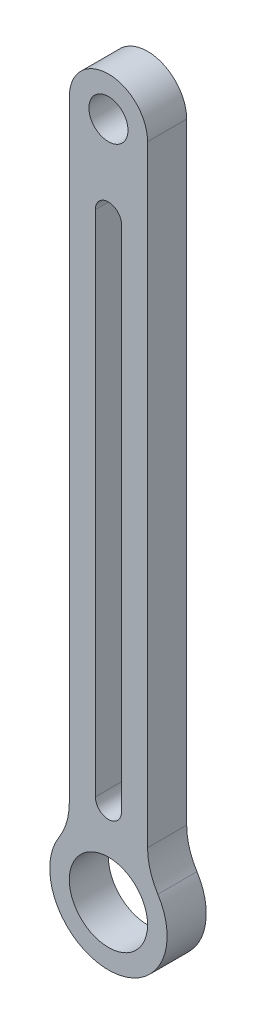
ISO-10303-21;
HEADER;
FILE_DESCRIPTION(('STEP AP214'),'2;1');
FILE_NAME('part.step','',(''),(''),'','','');
FILE_SCHEMA(('AUTOMOTIVE_DESIGN { 1 0 10303 214 1 1 1 1 }'));
ENDSEC;
DATA;
#1=APPLICATION_CONTEXT('core data for automotive mechanical design processes');
#2=APPLICATION_PROTOCOL_DEFINITION('international standard','automotive_design',2000,#1);
#3=PRODUCT_CONTEXT('',#1,'mechanical');
#4=PRODUCT('Part','Part','',(#3));
#5=PRODUCT_RELATED_PRODUCT_CATEGORY('part','',(#4));
#6=PRODUCT_DEFINITION_FORMATION('','',#4);
#7=PRODUCT_DEFINITION_CONTEXT('part definition',#1,'design');
#8=PRODUCT_DEFINITION('design','',#6,#7);
#9=PRODUCT_DEFINITION_SHAPE('','',#8);
#10=(LENGTH_UNIT() NAMED_UNIT(*) SI_UNIT(.MILLI.,.METRE.));
#11=(NAMED_UNIT(*) PLANE_ANGLE_UNIT() SI_UNIT($,.RADIAN.));
#12=(NAMED_UNIT(*) SI_UNIT($,.STERADIAN.) SOLID_ANGLE_UNIT());
#13=UNCERTAINTY_MEASURE_WITH_UNIT(LENGTH_MEASURE(1.E-05),#10,'distance_accuracy_value','');
#14=(GEOMETRIC_REPRESENTATION_CONTEXT(3) GLOBAL_UNCERTAINTY_ASSIGNED_CONTEXT((#13)) GLOBAL_UNIT_ASSIGNED_CONTEXT((#10,
#11,#12)) REPRESENTATION_CONTEXT('',''));
#15=CARTESIAN_POINT('',(0.,0.,0.));
#16=DIRECTION('',(0.,0.,1.));
#17=DIRECTION('',(1.,0.,0.));
#18=AXIS2_PLACEMENT_3D('',#15,#16,#17);
#19=CARTESIAN_POINT('',(6.,-52.,6.));
#20=DIRECTION('',(-1.,0.,0.));
#21=DIRECTION('',(0.,-1.,0.));
#22=AXIS2_PLACEMENT_3D('',#19,#20,#21);
#23=PLANE('',#22);
#24=DIRECTION('',(0.,1.,0.));
#25=VECTOR('',#24,1.);
#26=CARTESIAN_POINT('',(6.,-52.,6.));
#27=LINE('',#26,#25);
#28=CARTESIAN_POINT('',(6.,-41.7530492340404,6.));
#29=VERTEX_POINT('',#28);
#30=CARTESIAN_POINT('',(6.,52.,6.));
#31=VERTEX_POINT('',#30);
#32=EDGE_CURVE('E162',#29,#31,#27,.T.);
#33=ORIENTED_EDGE('',*,*,#32,.F.);
#34=DIRECTION('',(0.,0.,-1.));
#35=VECTOR('',#34,1.);
#36=CARTESIAN_POINT('',(6.,-41.7530492340404,6.));
#37=LINE('',#36,#35);
#38=CARTESIAN_POINT('',(6.,-41.7530492340404,0.));
#39=VERTEX_POINT('',#38);
#40=EDGE_CURVE('E188',#29,#39,#37,.T.);
#41=ORIENTED_EDGE('',*,*,#40,.T.);
#42=DIRECTION('',(0.,1.,0.));
#43=VECTOR('',#42,1.);
#44=CARTESIAN_POINT('',(6.,-52.,0.));
#45=LINE('',#44,#43);
#46=CARTESIAN_POINT('',(6.,52.,0.));
#47=VERTEX_POINT('',#46);
#48=EDGE_CURVE('E161',#39,#47,#45,.T.);
#49=ORIENTED_EDGE('',*,*,#48,.T.);
#50=DIRECTION('',(0.,0.,-1.));
#51=VECTOR('',#50,1.);
#52=CARTESIAN_POINT('',(6.,52.,6.));
#53=LINE('',#52,#51);
#54=EDGE_CURVE('E178',#31,#47,#53,.T.);
#55=ORIENTED_EDGE('',*,*,#54,.F.);
#56=EDGE_LOOP('',(#33,#41,#49,#55));
#57=FACE_BOUND('',#56,.T.);
#58=ADVANCED_FACE('F36',(#57),#23,.F.);
#59=CARTESIAN_POINT('',(0.,52.,6.));
#60=DIRECTION('',(0.,0.,-1.));
#61=DIRECTION('',(-1.,0.,0.));
#62=AXIS2_PLACEMENT_3D('',#59,#60,#61);
#63=CYLINDRICAL_SURFACE('',#62,6.);
#64=CARTESIAN_POINT('',(0.,52.,0.));
#65=DIRECTION('',(0.,0.,1.));
#66=DIRECTION('',(1.,0.,0.));
#67=AXIS2_PLACEMENT_3D('',#64,#65,#66);
#68=CIRCLE('',#67,6.);
#69=CARTESIAN_POINT('',(-6.00000000000002,52.,0.));
#70=VERTEX_POINT('',#69);
#71=EDGE_CURVE('E172',#47,#70,#68,.T.);
#72=ORIENTED_EDGE('',*,*,#71,.T.);
#73=DIRECTION('',(0.,0.,-1.));
#74=VECTOR('',#73,1.);
#75=CARTESIAN_POINT('',(-6.00000000000002,52.,6.));
#76=LINE('',#75,#74);
#77=CARTESIAN_POINT('',(-6.00000000000002,52.,6.));
#78=VERTEX_POINT('',#77);
#79=EDGE_CURVE('E170',#78,#70,#76,.T.);
#80=ORIENTED_EDGE('',*,*,#79,.F.);
#81=CARTESIAN_POINT('',(0.,52.,6.));
#82=DIRECTION('',(0.,0.,1.));
#83=DIRECTION('',(1.,0.,0.));
#84=AXIS2_PLACEMENT_3D('',#81,#82,#83);
#85=CIRCLE('',#84,6.);
#86=EDGE_CURVE('E164',#31,#78,#85,.T.);
#87=ORIENTED_EDGE('',*,*,#86,.F.);
#88=ORIENTED_EDGE('',*,*,#54,.T.);
#89=EDGE_LOOP('',(#72,#80,#87,#88));
#90=FACE_BOUND('',#89,.T.);
#91=ADVANCED_FACE('F215',(#90),#63,.T.);
#92=CARTESIAN_POINT('',(-6.,-52.,6.));
#93=DIRECTION('',(1.,0.,0.));
#94=DIRECTION('',(0.,1.,0.));
#95=AXIS2_PLACEMENT_3D('',#92,#93,#94);
#96=PLANE('',#95);
#97=DIRECTION('',(0.,-1.,0.));
#98=VECTOR('',#97,1.);
#99=CARTESIAN_POINT('',(-6.,-52.,0.));
#100=LINE('',#99,#98);
#101=CARTESIAN_POINT('',(-6.,-41.7530492340404,0.));
#102=VERTEX_POINT('',#101);
#103=EDGE_CURVE('E165',#70,#102,#100,.T.);
#104=ORIENTED_EDGE('',*,*,#103,.T.);
#105=DIRECTION('',(0.,0.,-1.));
#106=VECTOR('',#105,1.);
#107=CARTESIAN_POINT('',(-6.,-41.7530492340404,6.));
#108=LINE('',#107,#106);
#109=CARTESIAN_POINT('',(-6.,-41.7530492340404,6.));
#110=VERTEX_POINT('',#109);
#111=EDGE_CURVE('E181',#102,#110,#108,.F.);
#112=ORIENTED_EDGE('',*,*,#111,.T.);
#113=DIRECTION('',(0.,-1.,0.));
#114=VECTOR('',#113,1.);
#115=CARTESIAN_POINT('',(-6.,-52.,6.));
#116=LINE('',#115,#114);
#117=EDGE_CURVE('E167',#78,#110,#116,.T.);
#118=ORIENTED_EDGE('',*,*,#117,.F.);
#119=ORIENTED_EDGE('',*,*,#79,.T.);
#120=EDGE_LOOP('',(#104,#112,#118,#119));
#121=FACE_BOUND('',#120,.T.);
#122=ADVANCED_FACE('F218',(#121),#96,.F.);
#123=CARTESIAN_POINT('',(0.,-52.,6.));
#124=DIRECTION('',(0.,0.,1.));
#125=DIRECTION('',(1.,0.,0.));
#126=AXIS2_PLACEMENT_3D('',#123,#124,#125);
#127=PLANE('',#126);
#128=CARTESIAN_POINT('',(0.,-39.,6.));
#129=DIRECTION('',(0.,0.,1.));
#130=DIRECTION('',(1.,0.,0.));
#131=AXIS2_PLACEMENT_3D('',#128,#129,#130);
#132=CIRCLE('',#131,2.);
#133=CARTESIAN_POINT('',(-2.,-39.,6.));
#134=VERTEX_POINT('',#133);
#135=CARTESIAN_POINT('',(2.,-39.,6.));
#136=VERTEX_POINT('',#135);
#137=EDGE_CURVE('E51',#134,#136,#132,.T.);
#138=ORIENTED_EDGE('',*,*,#137,.F.);
#139=DIRECTION('',(0.,-1.,0.));
#140=VECTOR('',#139,1.);
#141=CARTESIAN_POINT('',(-2.,-39.,6.));
#142=LINE('',#141,#140);
#143=CARTESIAN_POINT('',(-2.00000000000001,39.,6.));
#144=VERTEX_POINT('',#143);
#145=EDGE_CURVE('E131',#144,#134,#142,.T.);
#146=ORIENTED_EDGE('',*,*,#145,.F.);
#147=CARTESIAN_POINT('',(0.,39.,6.));
#148=DIRECTION('',(0.,0.,1.));
#149=DIRECTION('',(1.,0.,0.));
#150=AXIS2_PLACEMENT_3D('',#147,#148,#149);
#151=CIRCLE('',#150,2.);
#152=CARTESIAN_POINT('',(2.,39.,6.));
#153=VERTEX_POINT('',#152);
#154=EDGE_CURVE('E115',#153,#144,#151,.T.);
#155=ORIENTED_EDGE('',*,*,#154,.F.);
#156=DIRECTION('',(0.,1.,0.));
#157=VECTOR('',#156,1.);
#158=CARTESIAN_POINT('',(2.,-39.,6.));
#159=LINE('',#158,#157);
#160=EDGE_CURVE('E124',#136,#153,#159,.T.);
#161=ORIENTED_EDGE('',*,*,#160,.F.);
#162=EDGE_LOOP('',(#138,#146,#155,#161));
#163=FACE_BOUND('',#162,.T.);
#164=CARTESIAN_POINT('',(0.,-52.,6.));
#165=DIRECTION('',(0.,0.,1.));
#166=DIRECTION('',(1.,0.,0.));
#167=AXIS2_PLACEMENT_3D('',#164,#165,#166);
#168=CIRCLE('',#167,6.);
#169=CARTESIAN_POINT('',(6.,-52.,6.));
#170=VERTEX_POINT('',#169);
#171=EDGE_CURVE('E147',#170,#170,#168,.F.);
#172=ORIENTED_EDGE('',*,*,#171,.T.);
#173=EDGE_LOOP('',(#172));
#174=FACE_BOUND('',#173,.T.);
#175=CARTESIAN_POINT('',(0.,52.,6.));
#176=DIRECTION('',(0.,0.,1.));
#177=DIRECTION('',(1.,0.,0.));
#178=AXIS2_PLACEMENT_3D('',#175,#176,#177);
#179=CIRCLE('',#178,3.);
#180=CARTESIAN_POINT('',(3.,52.,6.));
#181=VERTEX_POINT('',#180);
#182=EDGE_CURVE('E148',#181,#181,#179,.F.);
#183=ORIENTED_EDGE('',*,*,#182,.T.);
#184=EDGE_LOOP('',(#183));
#185=FACE_BOUND('',#184,.T.);
#186=CARTESIAN_POINT('',(0.,-52.,6.));
#187=DIRECTION('',(0.,0.,1.));
#188=DIRECTION('',(1.,0.,0.));
#189=AXIS2_PLACEMENT_3D('',#186,#187,#188);
#190=CIRCLE('',#189,9.);
#191=CARTESIAN_POINT('',(7.57894736842105,-47.1461812161244,6.));
#192=VERTEX_POINT('',#191);
#193=CARTESIAN_POINT('',(-7.57894736842105,-47.1461812161244,6.));
#194=VERTEX_POINT('',#193);
#195=EDGE_CURVE('E158',#192,#194,#190,.F.);
#196=ORIENTED_EDGE('',*,*,#195,.F.);
#197=CARTESIAN_POINT('',(16.,-41.7530492340404,6.));
#198=DIRECTION('',(0.,0.,1.));
#199=DIRECTION('',(1.,0.,0.));
#200=AXIS2_PLACEMENT_3D('',#197,#198,#199);
#201=CIRCLE('',#200,10.);
#202=EDGE_CURVE('E11',#192,#29,#201,.F.);
#203=ORIENTED_EDGE('',*,*,#202,.T.);
#204=ORIENTED_EDGE('',*,*,#32,.T.);
#205=ORIENTED_EDGE('',*,*,#86,.T.);
#206=ORIENTED_EDGE('',*,*,#117,.T.);
#207=CARTESIAN_POINT('',(-16.,-41.7530492340404,6.));
#208=DIRECTION('',(0.,0.,1.));
#209=DIRECTION('',(1.,0.,0.));
#210=AXIS2_PLACEMENT_3D('',#207,#208,#209);
#211=CIRCLE('',#210,10.);
#212=EDGE_CURVE('E191',#110,#194,#211,.F.);
#213=ORIENTED_EDGE('',*,*,#212,.T.);
#214=EDGE_LOOP('',(#196,#203,#204,#205,#206,#213));
#215=FACE_BOUND('',#214,.T.);
#216=ADVANCED_FACE('F128',(#163,#174,#185,#215),#127,.T.);
#217=CARTESIAN_POINT('',(0.,-52.,0.));
#218=DIRECTION('',(0.,0.,1.));
#219=DIRECTION('',(1.,0.,0.));
#220=AXIS2_PLACEMENT_3D('',#217,#218,#219);
#221=PLANE('',#220);
#222=DIRECTION('',(0.,1.,0.));
#223=VECTOR('',#222,1.);
#224=CARTESIAN_POINT('',(-2.,-39.,0.));
#225=LINE('',#224,#223);
#226=CARTESIAN_POINT('',(-2.,-39.,0.));
#227=VERTEX_POINT('',#226);
#228=CARTESIAN_POINT('',(-2.,39.,0.));
#229=VERTEX_POINT('',#228);
#230=EDGE_CURVE('E265',#227,#229,#225,.T.);
#231=ORIENTED_EDGE('',*,*,#230,.F.);
#232=CARTESIAN_POINT('',(0.,-39.,0.));
#233=DIRECTION('',(0.,0.,1.));
#234=DIRECTION('',(1.,0.,0.));
#235=AXIS2_PLACEMENT_3D('',#232,#233,#234);
#236=CIRCLE('',#235,2.);
#237=CARTESIAN_POINT('',(2.,-39.,0.));
#238=VERTEX_POINT('',#237);
#239=EDGE_CURVE('E143',#238,#227,#236,.F.);
#240=ORIENTED_EDGE('',*,*,#239,.F.);
#241=DIRECTION('',(0.,-1.,0.));
#242=VECTOR('',#241,1.);
#243=CARTESIAN_POINT('',(2.,-39.,0.));
#244=LINE('',#243,#242);
#245=CARTESIAN_POINT('',(1.99999999999999,39.,0.));
#246=VERTEX_POINT('',#245);
#247=EDGE_CURVE('E140',#246,#238,#244,.T.);
#248=ORIENTED_EDGE('',*,*,#247,.F.);
#249=CARTESIAN_POINT('',(0.,39.,0.));
#250=DIRECTION('',(0.,0.,1.));
#251=DIRECTION('',(1.,0.,0.));
#252=AXIS2_PLACEMENT_3D('',#249,#250,#251);
#253=CIRCLE('',#252,2.);
#254=EDGE_CURVE('E118',#229,#246,#253,.F.);
#255=ORIENTED_EDGE('',*,*,#254,.F.);
#256=EDGE_LOOP('',(#231,#240,#248,#255));
#257=FACE_BOUND('',#256,.T.);
#258=CARTESIAN_POINT('',(0.,-52.,0.));
#259=DIRECTION('',(0.,0.,-1.));
#260=DIRECTION('',(-1.,0.,0.));
#261=AXIS2_PLACEMENT_3D('',#258,#259,#260);
#262=CIRCLE('',#261,6.);
#263=CARTESIAN_POINT('',(-6.,-52.,0.));
#264=VERTEX_POINT('',#263);
#265=EDGE_CURVE('E144',#264,#264,#262,.T.);
#266=ORIENTED_EDGE('',*,*,#265,.F.);
#267=EDGE_LOOP('',(#266));
#268=FACE_BOUND('',#267,.T.);
#269=CARTESIAN_POINT('',(0.,52.,0.));
#270=DIRECTION('',(0.,0.,-1.));
#271=DIRECTION('',(-1.,0.,0.));
#272=AXIS2_PLACEMENT_3D('',#269,#270,#271);
#273=CIRCLE('',#272,3.);
#274=CARTESIAN_POINT('',(-3.,52.,0.));
#275=VERTEX_POINT('',#274);
#276=EDGE_CURVE('E142',#275,#275,#273,.T.);
#277=ORIENTED_EDGE('',*,*,#276,.F.);
#278=EDGE_LOOP('',(#277));
#279=FACE_BOUND('',#278,.T.);
#280=ORIENTED_EDGE('',*,*,#48,.F.);
#281=CARTESIAN_POINT('',(16.,-41.7530492340404,0.));
#282=DIRECTION('',(0.,0.,1.));
#283=DIRECTION('',(1.,0.,0.));
#284=AXIS2_PLACEMENT_3D('',#281,#282,#283);
#285=CIRCLE('',#284,10.);
#286=CARTESIAN_POINT('',(7.57894736842105,-47.1461812161244,0.));
#287=VERTEX_POINT('',#286);
#288=EDGE_CURVE('E44',#39,#287,#285,.T.);
#289=ORIENTED_EDGE('',*,*,#288,.T.);
#290=CARTESIAN_POINT('',(0.,-52.,0.));
#291=DIRECTION('',(0.,0.,-1.));
#292=DIRECTION('',(-1.,0.,0.));
#293=AXIS2_PLACEMENT_3D('',#290,#291,#292);
#294=CIRCLE('',#293,9.);
#295=CARTESIAN_POINT('',(-7.57894736842105,-47.1461812161244,0.));
#296=VERTEX_POINT('',#295);
#297=EDGE_CURVE('E151',#287,#296,#294,.T.);
#298=ORIENTED_EDGE('',*,*,#297,.T.);
#299=CARTESIAN_POINT('',(-16.,-41.7530492340404,0.));
#300=DIRECTION('',(0.,0.,1.));
#301=DIRECTION('',(1.,0.,0.));
#302=AXIS2_PLACEMENT_3D('',#299,#300,#301);
#303=CIRCLE('',#302,10.);
#304=EDGE_CURVE('E193',#296,#102,#303,.T.);
#305=ORIENTED_EDGE('',*,*,#304,.T.);
#306=ORIENTED_EDGE('',*,*,#103,.F.);
#307=ORIENTED_EDGE('',*,*,#71,.F.);
#308=EDGE_LOOP('',(#280,#289,#298,#305,#306,#307));
#309=FACE_BOUND('',#308,.T.);
#310=ADVANCED_FACE('F197',(#257,#268,#279,#309),#221,.F.);
#311=CARTESIAN_POINT('',(0.,-52.,31.4558441227157));
#312=DIRECTION('',(0.,0.,-1.));
#313=DIRECTION('',(-1.,0.,0.));
#314=AXIS2_PLACEMENT_3D('',#311,#312,#313);
#315=CYLINDRICAL_SURFACE('',#314,9.);
#316=ORIENTED_EDGE('',*,*,#195,.T.);
#317=DIRECTION('',(0.,0.,-1.));
#318=VECTOR('',#317,1.);
#319=CARTESIAN_POINT('',(-7.57894736842105,-47.1461812161244,31.4558441227157));
#320=LINE('',#319,#318);
#321=EDGE_CURVE('E186',#194,#296,#320,.T.);
#322=ORIENTED_EDGE('',*,*,#321,.T.);
#323=ORIENTED_EDGE('',*,*,#297,.F.);
#324=DIRECTION('',(0.,0.,-1.));
#325=VECTOR('',#324,1.);
#326=CARTESIAN_POINT('',(7.57894736842105,-47.1461812161244,31.4558441227157));
#327=LINE('',#326,#325);
#328=EDGE_CURVE('E184',#287,#192,#327,.F.);
#329=ORIENTED_EDGE('',*,*,#328,.T.);
#330=EDGE_LOOP('',(#316,#322,#323,#329));
#331=FACE_BOUND('',#330,.T.);
#332=ADVANCED_FACE('F204',(#331),#315,.T.);
#333=CARTESIAN_POINT('',(0.,52.,22.9705627484771));
#334=DIRECTION('',(0.,0.,-1.));
#335=DIRECTION('',(-1.,0.,0.));
#336=AXIS2_PLACEMENT_3D('',#333,#334,#335);
#337=CYLINDRICAL_SURFACE('',#336,3.);
#338=ORIENTED_EDGE('',*,*,#276,.T.);
#339=EDGE_LOOP('',(#338));
#340=FACE_BOUND('',#339,.T.);
#341=ORIENTED_EDGE('',*,*,#182,.F.);
#342=EDGE_LOOP('',(#341));
#343=FACE_BOUND('',#342,.T.);
#344=ADVANCED_FACE('F230',(#340,#343),#337,.F.);
#345=CARTESIAN_POINT('',(0.,-52.,22.9705627484771));
#346=DIRECTION('',(0.,0.,-1.));
#347=DIRECTION('',(-1.,0.,0.));
#348=AXIS2_PLACEMENT_3D('',#345,#346,#347);
#349=CYLINDRICAL_SURFACE('',#348,6.);
#350=ORIENTED_EDGE('',*,*,#265,.T.);
#351=EDGE_LOOP('',(#350));
#352=FACE_BOUND('',#351,.T.);
#353=ORIENTED_EDGE('',*,*,#171,.F.);
#354=EDGE_LOOP('',(#353));
#355=FACE_BOUND('',#354,.T.);
#356=ADVANCED_FACE('F224',(#352,#355),#349,.F.);
#357=CARTESIAN_POINT('',(-16.,-41.7530492340404,31.4558441227157));
#358=DIRECTION('',(0.,0.,-1.));
#359=DIRECTION('',(-1.,0.,0.));
#360=AXIS2_PLACEMENT_3D('',#357,#358,#359);
#361=CYLINDRICAL_SURFACE('',#360,10.);
#362=ORIENTED_EDGE('',*,*,#304,.F.);
#363=ORIENTED_EDGE('',*,*,#321,.F.);
#364=ORIENTED_EDGE('',*,*,#212,.F.);
#365=ORIENTED_EDGE('',*,*,#111,.F.);
#366=EDGE_LOOP('',(#362,#363,#364,#365));
#367=FACE_BOUND('',#366,.T.);
#368=ADVANCED_FACE('F222',(#367),#361,.F.);
#369=CARTESIAN_POINT('',(16.,-41.7530492340404,31.4558441227157));
#370=DIRECTION('',(0.,0.,-1.));
#371=DIRECTION('',(-1.,0.,0.));
#372=AXIS2_PLACEMENT_3D('',#369,#370,#371);
#373=CYLINDRICAL_SURFACE('',#372,10.);
#374=ORIENTED_EDGE('',*,*,#202,.F.);
#375=ORIENTED_EDGE('',*,*,#328,.F.);
#376=ORIENTED_EDGE('',*,*,#288,.F.);
#377=ORIENTED_EDGE('',*,*,#40,.F.);
#378=EDGE_LOOP('',(#374,#375,#376,#377));
#379=FACE_BOUND('',#378,.T.);
#380=ADVANCED_FACE('F38',(#379),#373,.F.);
#381=CARTESIAN_POINT('',(0.,-39.,-82.0975030070952));
#382=DIRECTION('',(0.,0.,1.));
#383=DIRECTION('',(1.,0.,0.));
#384=AXIS2_PLACEMENT_3D('',#381,#382,#383);
#385=CYLINDRICAL_SURFACE('',#384,2.);
#386=ORIENTED_EDGE('',*,*,#239,.T.);
#387=DIRECTION('',(0.,0.,1.));
#388=VECTOR('',#387,1.);
#389=CARTESIAN_POINT('',(-2.,-39.,-82.0975030070952));
#390=LINE('',#389,#388);
#391=EDGE_CURVE('E136',#227,#134,#390,.T.);
#392=ORIENTED_EDGE('',*,*,#391,.T.);
#393=ORIENTED_EDGE('',*,*,#137,.T.);
#394=DIRECTION('',(0.,0.,1.));
#395=VECTOR('',#394,1.);
#396=CARTESIAN_POINT('',(2.,-39.,-82.0975030070952));
#397=LINE('',#396,#395);
#398=EDGE_CURVE('E121',#238,#136,#397,.T.);
#399=ORIENTED_EDGE('',*,*,#398,.F.);
#400=EDGE_LOOP('',(#386,#392,#393,#399));
#401=FACE_BOUND('',#400,.T.);
#402=ADVANCED_FACE('F229',(#401),#385,.F.);
#403=CARTESIAN_POINT('',(-2.,-39.,-82.0975030070952));
#404=DIRECTION('',(-1.,0.,0.));
#405=DIRECTION('',(0.,-1.,0.));
#406=AXIS2_PLACEMENT_3D('',#403,#404,#405);
#407=PLANE('',#406);
#408=ORIENTED_EDGE('',*,*,#230,.T.);
#409=DIRECTION('',(0.,0.,1.));
#410=VECTOR('',#409,1.);
#411=CARTESIAN_POINT('',(-2.00000000000001,39.,-82.0975030070952));
#412=LINE('',#411,#410);
#413=EDGE_CURVE('E120',#229,#144,#412,.T.);
#414=ORIENTED_EDGE('',*,*,#413,.T.);
#415=ORIENTED_EDGE('',*,*,#145,.T.);
#416=ORIENTED_EDGE('',*,*,#391,.F.);
#417=EDGE_LOOP('',(#408,#414,#415,#416));
#418=FACE_BOUND('',#417,.T.);
#419=ADVANCED_FACE('F254',(#418),#407,.F.);
#420=CARTESIAN_POINT('',(0.,39.,-82.0975030070952));
#421=DIRECTION('',(0.,0.,1.));
#422=DIRECTION('',(1.,0.,0.));
#423=AXIS2_PLACEMENT_3D('',#420,#421,#422);
#424=CYLINDRICAL_SURFACE('',#423,2.);
#425=ORIENTED_EDGE('',*,*,#254,.T.);
#426=DIRECTION('',(0.,0.,1.));
#427=VECTOR('',#426,1.);
#428=CARTESIAN_POINT('',(2.,39.,-82.0975030070952));
#429=LINE('',#428,#427);
#430=EDGE_CURVE('E59',#246,#153,#429,.T.);
#431=ORIENTED_EDGE('',*,*,#430,.T.);
#432=ORIENTED_EDGE('',*,*,#154,.T.);
#433=ORIENTED_EDGE('',*,*,#413,.F.);
#434=EDGE_LOOP('',(#425,#431,#432,#433));
#435=FACE_BOUND('',#434,.T.);
#436=ADVANCED_FACE('F112',(#435),#424,.F.);
#437=CARTESIAN_POINT('',(2.,-39.,-82.0975030070952));
#438=DIRECTION('',(1.,0.,0.));
#439=DIRECTION('',(0.,1.,0.));
#440=AXIS2_PLACEMENT_3D('',#437,#438,#439);
#441=PLANE('',#440);
#442=ORIENTED_EDGE('',*,*,#247,.T.);
#443=ORIENTED_EDGE('',*,*,#398,.T.);
#444=ORIENTED_EDGE('',*,*,#160,.T.);
#445=ORIENTED_EDGE('',*,*,#430,.F.);
#446=EDGE_LOOP('',(#442,#443,#444,#445));
#447=FACE_BOUND('',#446,.T.);
#448=ADVANCED_FACE('F125',(#447),#441,.F.);
#449=CLOSED_SHELL('',(#58,#91,#122,#216,#310,#332,#344,#356,#368,#380,#402,#419,#436,#448));
#450=MANIFOLD_SOLID_BREP('B2',#449);
#451=ADVANCED_BREP_SHAPE_REPRESENTATION('',(#18,#450),#14);
#452=SHAPE_DEFINITION_REPRESENTATION(#9,#451);
ENDSEC;
END-ISO-10303-21;
